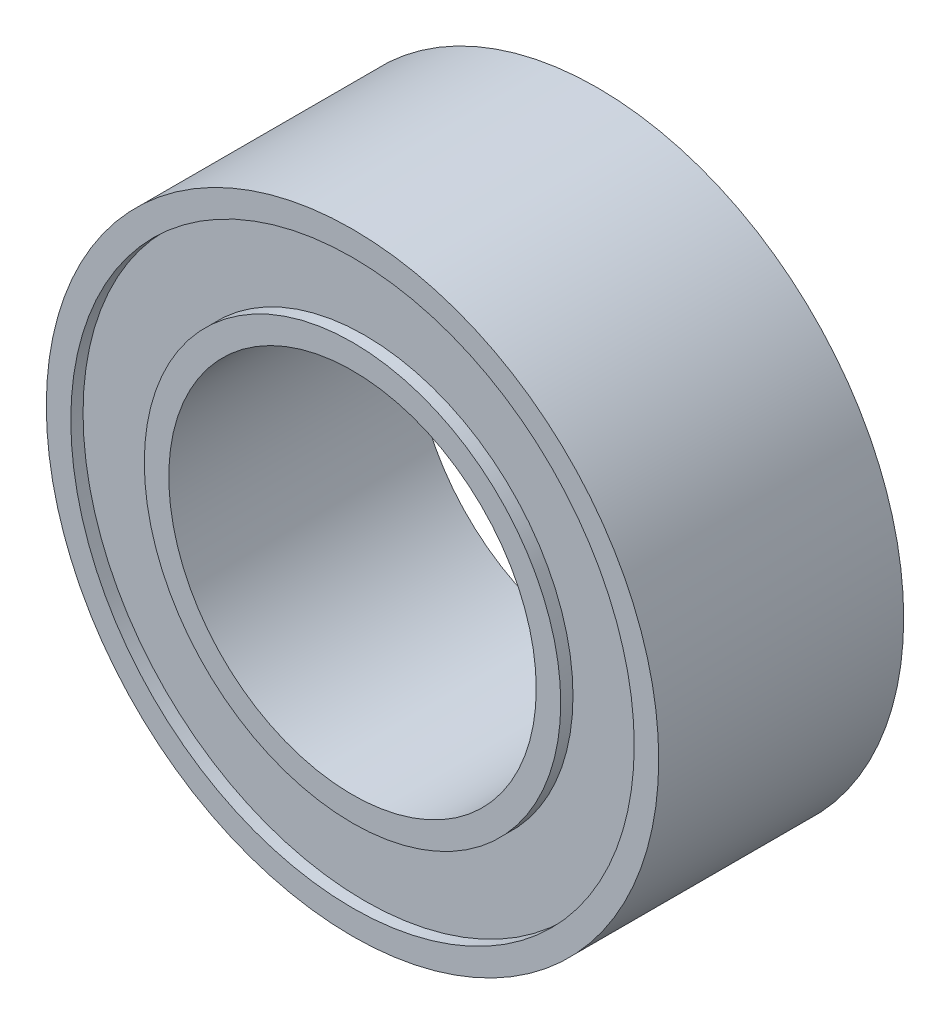
ISO-10303-21;
HEADER;
FILE_DESCRIPTION(('STEP AP214'),'2;1');
FILE_NAME('part.step','',(''),(''),'','','');
FILE_SCHEMA(('AUTOMOTIVE_DESIGN { 1 0 10303 214 1 1 1 1 }'));
ENDSEC;
DATA;
#1=APPLICATION_CONTEXT('core data for automotive mechanical design processes');
#2=APPLICATION_PROTOCOL_DEFINITION('international standard','automotive_design',2000,#1);
#3=PRODUCT_CONTEXT('',#1,'mechanical');
#4=PRODUCT('Part','Part','',(#3));
#5=PRODUCT_RELATED_PRODUCT_CATEGORY('part','',(#4));
#6=PRODUCT_DEFINITION_FORMATION('','',#4);
#7=PRODUCT_DEFINITION_CONTEXT('part definition',#1,'design');
#8=PRODUCT_DEFINITION('design','',#6,#7);
#9=PRODUCT_DEFINITION_SHAPE('','',#8);
#10=(LENGTH_UNIT() NAMED_UNIT(*) SI_UNIT(.MILLI.,.METRE.));
#11=(NAMED_UNIT(*) PLANE_ANGLE_UNIT() SI_UNIT($,.RADIAN.));
#12=(NAMED_UNIT(*) SI_UNIT($,.STERADIAN.) SOLID_ANGLE_UNIT());
#13=UNCERTAINTY_MEASURE_WITH_UNIT(LENGTH_MEASURE(1.E-05),#10,'distance_accuracy_value','');
#14=(GEOMETRIC_REPRESENTATION_CONTEXT(3) GLOBAL_UNCERTAINTY_ASSIGNED_CONTEXT((#13)) GLOBAL_UNIT_ASSIGNED_CONTEXT((#10,
#11,#12)) REPRESENTATION_CONTEXT('',''));
#15=CARTESIAN_POINT('',(0.,0.,0.));
#16=DIRECTION('',(0.,0.,1.));
#17=DIRECTION('',(1.,0.,0.));
#18=AXIS2_PLACEMENT_3D('',#15,#16,#17);
#19=CARTESIAN_POINT('',(0.,0.,0.));
#20=DIRECTION('',(0.,0.,1.));
#21=DIRECTION('',(1.,0.,0.));
#22=AXIS2_PLACEMENT_3D('',#19,#20,#21);
#23=PLANE('',#22);
#24=CARTESIAN_POINT('',(0.,0.,0.));
#25=DIRECTION('',(0.,0.,1.));
#26=DIRECTION('',(1.,0.,0.));
#27=AXIS2_PLACEMENT_3D('',#24,#25,#26);
#28=CIRCLE('',#27,15.);
#29=CARTESIAN_POINT('',(15.,0.,0.));
#30=VERTEX_POINT('',#29);
#31=EDGE_CURVE('E44',#30,#30,#28,.T.);
#32=ORIENTED_EDGE('',*,*,#31,.T.);
#33=EDGE_LOOP('',(#32));
#34=FACE_BOUND('',#33,.T.);
#35=CARTESIAN_POINT('',(0.,0.,0.));
#36=DIRECTION('',(0.,0.,-1.));
#37=DIRECTION('',(-1.,0.,0.));
#38=AXIS2_PLACEMENT_3D('',#35,#36,#37);
#39=CIRCLE('',#38,17.);
#40=CARTESIAN_POINT('',(-17.,0.,0.));
#41=VERTEX_POINT('',#40);
#42=EDGE_CURVE('E68',#41,#41,#39,.T.);
#43=ORIENTED_EDGE('',*,*,#42,.T.);
#44=EDGE_LOOP('',(#43));
#45=FACE_BOUND('',#44,.T.);
#46=ADVANCED_FACE('F31',(#34,#45),#23,.F.);
#47=CARTESIAN_POINT('',(0.,0.,20.));
#48=DIRECTION('',(0.,0.,1.));
#49=DIRECTION('',(1.,0.,0.));
#50=AXIS2_PLACEMENT_3D('',#47,#48,#49);
#51=PLANE('',#50);
#52=CARTESIAN_POINT('',(0.,0.,20.));
#53=DIRECTION('',(0.,0.,1.));
#54=DIRECTION('',(1.,0.,0.));
#55=AXIS2_PLACEMENT_3D('',#52,#53,#54);
#56=CIRCLE('',#55,15.);
#57=CARTESIAN_POINT('',(15.,0.,20.));
#58=VERTEX_POINT('',#57);
#59=EDGE_CURVE('E42',#58,#58,#56,.T.);
#60=ORIENTED_EDGE('',*,*,#59,.F.);
#61=EDGE_LOOP('',(#60));
#62=FACE_BOUND('',#61,.T.);
#63=CARTESIAN_POINT('',(0.,0.,20.));
#64=DIRECTION('',(0.,0.,1.));
#65=DIRECTION('',(1.,0.,0.));
#66=AXIS2_PLACEMENT_3D('',#63,#64,#65);
#67=CIRCLE('',#66,17.);
#68=CARTESIAN_POINT('',(17.,0.,20.));
#69=VERTEX_POINT('',#68);
#70=EDGE_CURVE('E56',#69,#69,#67,.T.);
#71=ORIENTED_EDGE('',*,*,#70,.T.);
#72=EDGE_LOOP('',(#71));
#73=FACE_BOUND('',#72,.T.);
#74=ADVANCED_FACE('F106',(#62,#73),#51,.T.);
#75=CARTESIAN_POINT('',(0.,0.,20.));
#76=DIRECTION('',(0.,0.,1.));
#77=DIRECTION('',(1.,0.,0.));
#78=AXIS2_PLACEMENT_3D('',#75,#76,#77);
#79=CIRCLE('',#78,23.);
#80=CARTESIAN_POINT('',(23.,0.,20.));
#81=VERTEX_POINT('',#80);
#82=EDGE_CURVE('E50',#81,#81,#79,.T.);
#83=ORIENTED_EDGE('',*,*,#82,.F.);
#84=EDGE_LOOP('',(#83));
#85=FACE_BOUND('',#84,.T.);
#86=CARTESIAN_POINT('',(0.,0.,20.));
#87=DIRECTION('',(0.,0.,1.));
#88=DIRECTION('',(1.,0.,0.));
#89=AXIS2_PLACEMENT_3D('',#86,#87,#88);
#90=CIRCLE('',#89,25.);
#91=CARTESIAN_POINT('',(25.,0.,20.));
#92=VERTEX_POINT('',#91);
#93=EDGE_CURVE('E10',#92,#92,#90,.T.);
#94=ORIENTED_EDGE('',*,*,#93,.T.);
#95=EDGE_LOOP('',(#94));
#96=FACE_BOUND('',#95,.T.);
#97=ADVANCED_FACE('F93',(#85,#96),#51,.T.);
#98=CARTESIAN_POINT('',(0.,0.,0.));
#99=DIRECTION('',(0.,0.,-1.));
#100=DIRECTION('',(-1.,0.,0.));
#101=AXIS2_PLACEMENT_3D('',#98,#99,#100);
#102=CIRCLE('',#101,23.);
#103=CARTESIAN_POINT('',(-23.,0.,0.));
#104=VERTEX_POINT('',#103);
#105=EDGE_CURVE('E62',#104,#104,#102,.T.);
#106=ORIENTED_EDGE('',*,*,#105,.F.);
#107=EDGE_LOOP('',(#106));
#108=FACE_BOUND('',#107,.T.);
#109=CARTESIAN_POINT('',(0.,0.,0.));
#110=DIRECTION('',(0.,0.,1.));
#111=DIRECTION('',(1.,0.,0.));
#112=AXIS2_PLACEMENT_3D('',#109,#110,#111);
#113=CIRCLE('',#112,25.);
#114=CARTESIAN_POINT('',(25.,0.,0.));
#115=VERTEX_POINT('',#114);
#116=EDGE_CURVE('E35',#115,#115,#113,.T.);
#117=ORIENTED_EDGE('',*,*,#116,.F.);
#118=EDGE_LOOP('',(#117));
#119=FACE_BOUND('',#118,.T.);
#120=ADVANCED_FACE('F90',(#108,#119),#23,.F.);
#121=CARTESIAN_POINT('',(0.,0.,20.));
#122=DIRECTION('',(0.,0.,-1.));
#123=DIRECTION('',(-1.,0.,0.));
#124=AXIS2_PLACEMENT_3D('',#121,#122,#123);
#125=CYLINDRICAL_SURFACE('',#124,25.);
#126=ORIENTED_EDGE('',*,*,#93,.F.);
#127=EDGE_LOOP('',(#126));
#128=FACE_BOUND('',#127,.T.);
#129=ORIENTED_EDGE('',*,*,#116,.T.);
#130=EDGE_LOOP('',(#129));
#131=FACE_BOUND('',#130,.T.);
#132=ADVANCED_FACE('F33',(#128,#131),#125,.T.);
#133=CARTESIAN_POINT('',(0.,0.,20.));
#134=DIRECTION('',(0.,0.,-1.));
#135=DIRECTION('',(-1.,0.,0.));
#136=AXIS2_PLACEMENT_3D('',#133,#134,#135);
#137=CYLINDRICAL_SURFACE('',#136,15.);
#138=ORIENTED_EDGE('',*,*,#59,.T.);
#139=EDGE_LOOP('',(#138));
#140=FACE_BOUND('',#139,.T.);
#141=ORIENTED_EDGE('',*,*,#31,.F.);
#142=EDGE_LOOP('',(#141));
#143=FACE_BOUND('',#142,.T.);
#144=ADVANCED_FACE('F97',(#140,#143),#137,.F.);
#145=CARTESIAN_POINT('',(0.,0.,19.));
#146=DIRECTION('',(0.,0.,1.));
#147=DIRECTION('',(1.,0.,0.));
#148=AXIS2_PLACEMENT_3D('',#145,#146,#147);
#149=CYLINDRICAL_SURFACE('',#148,23.);
#150=CARTESIAN_POINT('',(0.,0.,19.));
#151=DIRECTION('',(0.,0.,1.));
#152=DIRECTION('',(1.,0.,0.));
#153=AXIS2_PLACEMENT_3D('',#150,#151,#152);
#154=CIRCLE('',#153,23.);
#155=CARTESIAN_POINT('',(23.,0.,19.));
#156=VERTEX_POINT('',#155);
#157=EDGE_CURVE('E47',#156,#156,#154,.T.);
#158=ORIENTED_EDGE('',*,*,#157,.F.);
#159=EDGE_LOOP('',(#158));
#160=FACE_BOUND('',#159,.T.);
#161=ORIENTED_EDGE('',*,*,#82,.T.);
#162=EDGE_LOOP('',(#161));
#163=FACE_BOUND('',#162,.T.);
#164=ADVANCED_FACE('F102',(#160,#163),#149,.F.);
#165=CARTESIAN_POINT('',(0.,0.,19.));
#166=DIRECTION('',(0.,0.,1.));
#167=DIRECTION('',(1.,0.,0.));
#168=AXIS2_PLACEMENT_3D('',#165,#166,#167);
#169=PLANE('',#168);
#170=CARTESIAN_POINT('',(0.,0.,19.));
#171=DIRECTION('',(0.,0.,1.));
#172=DIRECTION('',(1.,0.,0.));
#173=AXIS2_PLACEMENT_3D('',#170,#171,#172);
#174=CIRCLE('',#173,17.);
#175=CARTESIAN_POINT('',(17.,0.,19.));
#176=VERTEX_POINT('',#175);
#177=EDGE_CURVE('E53',#176,#176,#174,.T.);
#178=ORIENTED_EDGE('',*,*,#177,.F.);
#179=EDGE_LOOP('',(#178));
#180=FACE_BOUND('',#179,.T.);
#181=ORIENTED_EDGE('',*,*,#157,.T.);
#182=EDGE_LOOP('',(#181));
#183=FACE_BOUND('',#182,.T.);
#184=ADVANCED_FACE('F119',(#180,#183),#169,.T.);
#185=CARTESIAN_POINT('',(0.,0.,19.));
#186=DIRECTION('',(0.,0.,1.));
#187=DIRECTION('',(1.,0.,0.));
#188=AXIS2_PLACEMENT_3D('',#185,#186,#187);
#189=CYLINDRICAL_SURFACE('',#188,17.);
#190=ORIENTED_EDGE('',*,*,#177,.T.);
#191=EDGE_LOOP('',(#190));
#192=FACE_BOUND('',#191,.T.);
#193=ORIENTED_EDGE('',*,*,#70,.F.);
#194=EDGE_LOOP('',(#193));
#195=FACE_BOUND('',#194,.T.);
#196=ADVANCED_FACE('F86',(#192,#195),#189,.T.);
#197=CARTESIAN_POINT('',(0.,0.,1.));
#198=DIRECTION('',(0.,0.,-1.));
#199=DIRECTION('',(-1.,0.,0.));
#200=AXIS2_PLACEMENT_3D('',#197,#198,#199);
#201=CYLINDRICAL_SURFACE('',#200,23.);
#202=CARTESIAN_POINT('',(0.,0.,1.));
#203=DIRECTION('',(0.,0.,-1.));
#204=DIRECTION('',(-1.,0.,0.));
#205=AXIS2_PLACEMENT_3D('',#202,#203,#204);
#206=CIRCLE('',#205,23.);
#207=CARTESIAN_POINT('',(-23.,0.,1.));
#208=VERTEX_POINT('',#207);
#209=EDGE_CURVE('E59',#208,#208,#206,.T.);
#210=ORIENTED_EDGE('',*,*,#209,.F.);
#211=EDGE_LOOP('',(#210));
#212=FACE_BOUND('',#211,.T.);
#213=ORIENTED_EDGE('',*,*,#105,.T.);
#214=EDGE_LOOP('',(#213));
#215=FACE_BOUND('',#214,.T.);
#216=ADVANCED_FACE('F80',(#212,#215),#201,.F.);
#217=CARTESIAN_POINT('',(0.,0.,1.));
#218=DIRECTION('',(0.,0.,-1.));
#219=DIRECTION('',(-1.,0.,0.));
#220=AXIS2_PLACEMENT_3D('',#217,#218,#219);
#221=PLANE('',#220);
#222=CARTESIAN_POINT('',(0.,0.,1.));
#223=DIRECTION('',(0.,0.,-1.));
#224=DIRECTION('',(-1.,0.,0.));
#225=AXIS2_PLACEMENT_3D('',#222,#223,#224);
#226=CIRCLE('',#225,17.);
#227=CARTESIAN_POINT('',(-17.,0.,1.));
#228=VERTEX_POINT('',#227);
#229=EDGE_CURVE('E65',#228,#228,#226,.T.);
#230=ORIENTED_EDGE('',*,*,#229,.F.);
#231=EDGE_LOOP('',(#230));
#232=FACE_BOUND('',#231,.T.);
#233=ORIENTED_EDGE('',*,*,#209,.T.);
#234=EDGE_LOOP('',(#233));
#235=FACE_BOUND('',#234,.T.);
#236=ADVANCED_FACE('F77',(#232,#235),#221,.T.);
#237=CARTESIAN_POINT('',(0.,0.,1.));
#238=DIRECTION('',(0.,0.,-1.));
#239=DIRECTION('',(-1.,0.,0.));
#240=AXIS2_PLACEMENT_3D('',#237,#238,#239);
#241=CYLINDRICAL_SURFACE('',#240,17.);
#242=ORIENTED_EDGE('',*,*,#229,.T.);
#243=EDGE_LOOP('',(#242));
#244=FACE_BOUND('',#243,.T.);
#245=ORIENTED_EDGE('',*,*,#42,.F.);
#246=EDGE_LOOP('',(#245));
#247=FACE_BOUND('',#246,.T.);
#248=ADVANCED_FACE('F74',(#244,#247),#241,.T.);
#249=CLOSED_SHELL('',(#46,#74,#97,#120,#132,#144,#164,#184,#196,#216,#236,#248));
#250=MANIFOLD_SOLID_BREP('B2',#249);
#251=ADVANCED_BREP_SHAPE_REPRESENTATION('',(#18,#250),#14);
#252=SHAPE_DEFINITION_REPRESENTATION(#9,#251);
ENDSEC;
END-ISO-10303-21;
